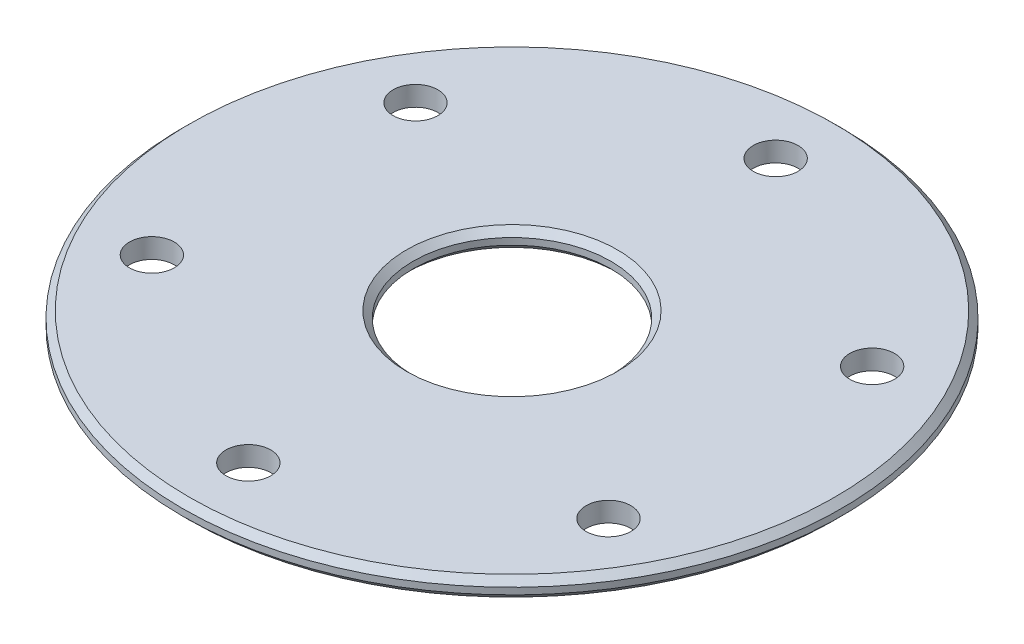
ISO-10303-21;
HEADER;
FILE_DESCRIPTION(('STEP AP214'),'2;1');
FILE_NAME('part.step','',(''),(''),'','','');
FILE_SCHEMA(('AUTOMOTIVE_DESIGN { 1 0 10303 214 1 1 1 1 }'));
ENDSEC;
DATA;
#1=APPLICATION_CONTEXT('core data for automotive mechanical design processes');
#2=APPLICATION_PROTOCOL_DEFINITION('international standard','automotive_design',2000,#1);
#3=PRODUCT_CONTEXT('',#1,'mechanical');
#4=PRODUCT('Part','Part','',(#3));
#5=PRODUCT_RELATED_PRODUCT_CATEGORY('part','',(#4));
#6=PRODUCT_DEFINITION_FORMATION('','',#4);
#7=PRODUCT_DEFINITION_CONTEXT('part definition',#1,'design');
#8=PRODUCT_DEFINITION('design','',#6,#7);
#9=PRODUCT_DEFINITION_SHAPE('','',#8);
#10=(LENGTH_UNIT() NAMED_UNIT(*) SI_UNIT(.MILLI.,.METRE.));
#11=(NAMED_UNIT(*) PLANE_ANGLE_UNIT() SI_UNIT($,.RADIAN.));
#12=(NAMED_UNIT(*) SI_UNIT($,.STERADIAN.) SOLID_ANGLE_UNIT());
#13=UNCERTAINTY_MEASURE_WITH_UNIT(LENGTH_MEASURE(1.E-05),#10,'distance_accuracy_value','');
#14=(GEOMETRIC_REPRESENTATION_CONTEXT(3) GLOBAL_UNCERTAINTY_ASSIGNED_CONTEXT((#13)) GLOBAL_UNIT_ASSIGNED_CONTEXT((#10,
#11,#12)) REPRESENTATION_CONTEXT('',''));
#15=CARTESIAN_POINT('',(0.,0.,0.));
#16=DIRECTION('',(0.,0.,1.));
#17=DIRECTION('',(1.,0.,0.));
#18=AXIS2_PLACEMENT_3D('',#15,#16,#17);
#19=CARTESIAN_POINT('',(0.,3.,0.));
#20=DIRECTION('',(0.,-1.,0.));
#21=DIRECTION('',(0.,0.,-1.));
#22=AXIS2_PLACEMENT_3D('',#19,#20,#21);
#23=CYLINDRICAL_SURFACE('',#22,50.);
#24=CARTESIAN_POINT('',(0.,1.99999999999999,0.));
#25=DIRECTION('',(0.,1.,0.));
#26=DIRECTION('',(0.,0.,1.));
#27=AXIS2_PLACEMENT_3D('',#24,#25,#26);
#28=CIRCLE('',#27,50.);
#29=CARTESIAN_POINT('',(0.,1.99999999999999,50.));
#30=VERTEX_POINT('',#29);
#31=EDGE_CURVE('E10',#30,#30,#28,.F.);
#32=ORIENTED_EDGE('',*,*,#31,.T.);
#33=EDGE_LOOP('',(#32));
#34=FACE_BOUND('',#33,.T.);
#35=CARTESIAN_POINT('',(0.,1.,0.));
#36=DIRECTION('',(0.,1.,0.));
#37=DIRECTION('',(0.,0.,1.));
#38=AXIS2_PLACEMENT_3D('',#35,#36,#37);
#39=CIRCLE('',#38,50.);
#40=CARTESIAN_POINT('',(0.,1.,50.));
#41=VERTEX_POINT('',#40);
#42=EDGE_CURVE('E44',#41,#41,#39,.T.);
#43=ORIENTED_EDGE('',*,*,#42,.T.);
#44=EDGE_LOOP('',(#43));
#45=FACE_BOUND('',#44,.T.);
#46=ADVANCED_FACE('F36',(#34,#45),#23,.T.);
#47=CARTESIAN_POINT('',(0.,3.,0.));
#48=DIRECTION('',(0.,1.,0.));
#49=DIRECTION('',(0.,0.,1.));
#50=AXIS2_PLACEMENT_3D('',#47,#48,#49);
#51=PLANE('',#50);
#52=CARTESIAN_POINT('',(0.,3.,0.));
#53=DIRECTION('',(0.,1.,0.));
#54=DIRECTION('',(0.,0.,1.));
#55=AXIS2_PLACEMENT_3D('',#52,#53,#54);
#56=CIRCLE('',#55,16.);
#57=CARTESIAN_POINT('',(0.,3.,16.));
#58=VERTEX_POINT('',#57);
#59=EDGE_CURVE('E63',#58,#58,#56,.F.);
#60=ORIENTED_EDGE('',*,*,#59,.T.);
#61=EDGE_LOOP('',(#60));
#62=FACE_BOUND('',#61,.T.);
#63=CARTESIAN_POINT('',(0.,3.,0.));
#64=DIRECTION('',(0.,1.,0.));
#65=DIRECTION('',(0.,0.,1.));
#66=AXIS2_PLACEMENT_3D('',#63,#64,#65);
#67=CIRCLE('',#66,49.);
#68=CARTESIAN_POINT('',(0.,3.,49.));
#69=VERTEX_POINT('',#68);
#70=EDGE_CURVE('E66',#69,#69,#67,.T.);
#71=ORIENTED_EDGE('',*,*,#70,.T.);
#72=EDGE_LOOP('',(#71));
#73=FACE_BOUND('',#72,.T.);
#74=CARTESIAN_POINT('',(-34.6410161513773,3.,20.0000000000004));
#75=DIRECTION('',(0.,1.,0.));
#76=DIRECTION('',(-0.866025403784433,0.,0.50000000000001));
#77=AXIS2_PLACEMENT_3D('',#74,#75,#76);
#78=CIRCLE('',#77,3.39999999999999);
#79=CARTESIAN_POINT('',(-37.5855025242444,3.,21.7000000000004));
#80=VERTEX_POINT('',#79);
#81=EDGE_CURVE('E86',#80,#80,#78,.T.);
#82=ORIENTED_EDGE('',*,*,#81,.F.);
#83=EDGE_LOOP('',(#82));
#84=FACE_BOUND('',#83,.T.);
#85=CARTESIAN_POINT('',(-34.6410161513777,3.,-19.9999999999997));
#86=DIRECTION('',(0.,1.,0.));
#87=DIRECTION('',(-0.866025403784443,0.,-0.499999999999992));
#88=AXIS2_PLACEMENT_3D('',#85,#86,#87);
#89=CIRCLE('',#88,3.39999999999999);
#90=CARTESIAN_POINT('',(-37.5855025242448,3.,-21.6999999999996));
#91=VERTEX_POINT('',#90);
#92=EDGE_CURVE('E85',#91,#91,#89,.T.);
#93=ORIENTED_EDGE('',*,*,#92,.F.);
#94=EDGE_LOOP('',(#93));
#95=FACE_BOUND('',#94,.T.);
#96=CARTESIAN_POINT('',(0.,3.,-40.));
#97=DIRECTION('',(0.,1.,0.));
#98=DIRECTION('',(0.,0.,-1.));
#99=AXIS2_PLACEMENT_3D('',#96,#97,#98);
#100=CIRCLE('',#99,3.39999999999999);
#101=CARTESIAN_POINT('',(0.,3.,-43.4));
#102=VERTEX_POINT('',#101);
#103=EDGE_CURVE('E92',#102,#102,#100,.T.);
#104=ORIENTED_EDGE('',*,*,#103,.F.);
#105=EDGE_LOOP('',(#104));
#106=FACE_BOUND('',#105,.T.);
#107=CARTESIAN_POINT('',(34.6410161513775,3.,-20.0000000000002));
#108=DIRECTION('',(0.,1.,0.));
#109=DIRECTION('',(0.866025403784436,0.,-0.500000000000004));
#110=AXIS2_PLACEMENT_3D('',#107,#108,#109);
#111=CIRCLE('',#110,3.39999999999999);
#112=CARTESIAN_POINT('',(37.5855025242445,3.,-21.7000000000002));
#113=VERTEX_POINT('',#112);
#114=EDGE_CURVE('E98',#113,#113,#111,.T.);
#115=ORIENTED_EDGE('',*,*,#114,.F.);
#116=EDGE_LOOP('',(#115));
#117=FACE_BOUND('',#116,.T.);
#118=CARTESIAN_POINT('',(34.6410161513776,3.,19.9999999999999));
#119=DIRECTION('',(0.,1.,0.));
#120=DIRECTION('',(0.86602540378444,0.,0.499999999999998));
#121=AXIS2_PLACEMENT_3D('',#118,#119,#120);
#122=CIRCLE('',#121,3.39999999999999);
#123=CARTESIAN_POINT('',(37.5855025242447,3.,21.6999999999999));
#124=VERTEX_POINT('',#123);
#125=EDGE_CURVE('E78',#124,#124,#122,.T.);
#126=ORIENTED_EDGE('',*,*,#125,.F.);
#127=EDGE_LOOP('',(#126));
#128=FACE_BOUND('',#127,.T.);
#129=CARTESIAN_POINT('',(0.,3.,40.));
#130=DIRECTION('',(0.,1.,0.));
#131=DIRECTION('',(0.,0.,1.));
#132=AXIS2_PLACEMENT_3D('',#129,#130,#131);
#133=CIRCLE('',#132,3.39999999999999);
#134=CARTESIAN_POINT('',(0.,3.,43.4));
#135=VERTEX_POINT('',#134);
#136=EDGE_CURVE('E69',#135,#135,#133,.T.);
#137=ORIENTED_EDGE('',*,*,#136,.F.);
#138=EDGE_LOOP('',(#137));
#139=FACE_BOUND('',#138,.T.);
#140=ADVANCED_FACE('F109',(#62,#73,#84,#95,#106,#117,#128,#139),#51,.T.);
#141=CARTESIAN_POINT('',(0.,0.,0.));
#142=DIRECTION('',(0.,1.,0.));
#143=DIRECTION('',(0.,0.,1.));
#144=AXIS2_PLACEMENT_3D('',#141,#142,#143);
#145=PLANE('',#144);
#146=CARTESIAN_POINT('',(0.,0.,0.));
#147=DIRECTION('',(0.,1.,0.));
#148=DIRECTION('',(0.,0.,1.));
#149=AXIS2_PLACEMENT_3D('',#146,#147,#148);
#150=CIRCLE('',#149,16.);
#151=CARTESIAN_POINT('',(0.,0.,16.));
#152=VERTEX_POINT('',#151);
#153=EDGE_CURVE('E48',#152,#152,#150,.T.);
#154=ORIENTED_EDGE('',*,*,#153,.T.);
#155=EDGE_LOOP('',(#154));
#156=FACE_BOUND('',#155,.T.);
#157=CARTESIAN_POINT('',(0.,0.,0.));
#158=DIRECTION('',(0.,1.,0.));
#159=DIRECTION('',(0.,0.,1.));
#160=AXIS2_PLACEMENT_3D('',#157,#158,#159);
#161=CIRCLE('',#160,49.);
#162=CARTESIAN_POINT('',(0.,0.,49.));
#163=VERTEX_POINT('',#162);
#164=EDGE_CURVE('E52',#163,#163,#161,.F.);
#165=ORIENTED_EDGE('',*,*,#164,.T.);
#166=EDGE_LOOP('',(#165));
#167=FACE_BOUND('',#166,.T.);
#168=CARTESIAN_POINT('',(-34.6410161513773,0.,20.0000000000004));
#169=DIRECTION('',(0.,-1.,0.));
#170=DIRECTION('',(0.866025403784433,0.,-0.50000000000001));
#171=AXIS2_PLACEMENT_3D('',#168,#169,#170);
#172=CIRCLE('',#171,3.39999999999999);
#173=CARTESIAN_POINT('',(-31.6965297785103,0.,18.3000000000004));
#174=VERTEX_POINT('',#173);
#175=EDGE_CURVE('E82',#174,#174,#172,.T.);
#176=ORIENTED_EDGE('',*,*,#175,.F.);
#177=EDGE_LOOP('',(#176));
#178=FACE_BOUND('',#177,.T.);
#179=CARTESIAN_POINT('',(-34.6410161513777,0.,-19.9999999999997));
#180=DIRECTION('',(0.,-1.,0.));
#181=DIRECTION('',(0.866025403784443,0.,0.499999999999992));
#182=AXIS2_PLACEMENT_3D('',#179,#180,#181);
#183=CIRCLE('',#182,3.39999999999999);
#184=CARTESIAN_POINT('',(-31.6965297785106,0.,-18.2999999999997));
#185=VERTEX_POINT('',#184);
#186=EDGE_CURVE('E89',#185,#185,#183,.T.);
#187=ORIENTED_EDGE('',*,*,#186,.F.);
#188=EDGE_LOOP('',(#187));
#189=FACE_BOUND('',#188,.T.);
#190=CARTESIAN_POINT('',(0.,0.,-40.));
#191=DIRECTION('',(0.,-1.,0.));
#192=DIRECTION('',(0.,0.,1.));
#193=AXIS2_PLACEMENT_3D('',#190,#191,#192);
#194=CIRCLE('',#193,3.39999999999999);
#195=CARTESIAN_POINT('',(0.,0.,-36.6));
#196=VERTEX_POINT('',#195);
#197=EDGE_CURVE('E95',#196,#196,#194,.T.);
#198=ORIENTED_EDGE('',*,*,#197,.F.);
#199=EDGE_LOOP('',(#198));
#200=FACE_BOUND('',#199,.T.);
#201=CARTESIAN_POINT('',(34.6410161513775,0.,-20.0000000000002));
#202=DIRECTION('',(0.,-1.,0.));
#203=DIRECTION('',(-0.866025403784436,0.,0.500000000000004));
#204=AXIS2_PLACEMENT_3D('',#201,#202,#203);
#205=CIRCLE('',#204,3.39999999999999);
#206=CARTESIAN_POINT('',(31.6965297785104,0.,-18.3000000000002));
#207=VERTEX_POINT('',#206);
#208=EDGE_CURVE('E81',#207,#207,#205,.T.);
#209=ORIENTED_EDGE('',*,*,#208,.F.);
#210=EDGE_LOOP('',(#209));
#211=FACE_BOUND('',#210,.T.);
#212=CARTESIAN_POINT('',(34.6410161513776,0.,19.9999999999999));
#213=DIRECTION('',(0.,-1.,0.));
#214=DIRECTION('',(-0.86602540378444,0.,-0.499999999999998));
#215=AXIS2_PLACEMENT_3D('',#212,#213,#214);
#216=CIRCLE('',#215,3.39999999999999);
#217=CARTESIAN_POINT('',(31.6965297785105,0.,18.2999999999999));
#218=VERTEX_POINT('',#217);
#219=EDGE_CURVE('E75',#218,#218,#216,.T.);
#220=ORIENTED_EDGE('',*,*,#219,.F.);
#221=EDGE_LOOP('',(#220));
#222=FACE_BOUND('',#221,.T.);
#223=CARTESIAN_POINT('',(0.,0.,40.));
#224=DIRECTION('',(0.,-1.,0.));
#225=DIRECTION('',(0.,0.,-1.));
#226=AXIS2_PLACEMENT_3D('',#223,#224,#225);
#227=CIRCLE('',#226,3.39999999999999);
#228=CARTESIAN_POINT('',(0.,0.,36.6));
#229=VERTEX_POINT('',#228);
#230=EDGE_CURVE('E72',#229,#229,#227,.T.);
#231=ORIENTED_EDGE('',*,*,#230,.F.);
#232=EDGE_LOOP('',(#231));
#233=FACE_BOUND('',#232,.T.);
#234=ADVANCED_FACE('F112',(#156,#167,#178,#189,#200,#211,#222,#233),#145,.F.);
#235=CARTESIAN_POINT('',(0.,0.,40.));
#236=DIRECTION('',(0.,-1.,0.));
#237=DIRECTION('',(0.,0.,-1.));
#238=AXIS2_PLACEMENT_3D('',#235,#236,#237);
#239=CYLINDRICAL_SURFACE('',#238,3.39999999999999);
#240=ORIENTED_EDGE('',*,*,#136,.T.);
#241=EDGE_LOOP('',(#240));
#242=FACE_BOUND('',#241,.T.);
#243=ORIENTED_EDGE('',*,*,#230,.T.);
#244=EDGE_LOOP('',(#243));
#245=FACE_BOUND('',#244,.T.);
#246=ADVANCED_FACE('F119',(#242,#245),#239,.F.);
#247=CARTESIAN_POINT('',(34.6410161513776,0.,19.9999999999999));
#248=DIRECTION('',(0.,-1.,0.));
#249=DIRECTION('',(-0.86602540378444,0.,-0.499999999999998));
#250=AXIS2_PLACEMENT_3D('',#247,#248,#249);
#251=CYLINDRICAL_SURFACE('',#250,3.39999999999999);
#252=ORIENTED_EDGE('',*,*,#125,.T.);
#253=EDGE_LOOP('',(#252));
#254=FACE_BOUND('',#253,.T.);
#255=ORIENTED_EDGE('',*,*,#219,.T.);
#256=EDGE_LOOP('',(#255));
#257=FACE_BOUND('',#256,.T.);
#258=ADVANCED_FACE('F122',(#254,#257),#251,.F.);
#259=CARTESIAN_POINT('',(34.6410161513775,0.,-20.0000000000002));
#260=DIRECTION('',(0.,-1.,0.));
#261=DIRECTION('',(-0.866025403784436,0.,0.500000000000004));
#262=AXIS2_PLACEMENT_3D('',#259,#260,#261);
#263=CYLINDRICAL_SURFACE('',#262,3.39999999999999);
#264=ORIENTED_EDGE('',*,*,#114,.T.);
#265=EDGE_LOOP('',(#264));
#266=FACE_BOUND('',#265,.T.);
#267=ORIENTED_EDGE('',*,*,#208,.T.);
#268=EDGE_LOOP('',(#267));
#269=FACE_BOUND('',#268,.T.);
#270=ADVANCED_FACE('F106',(#266,#269),#263,.F.);
#271=CARTESIAN_POINT('',(0.,0.,-40.));
#272=DIRECTION('',(0.,-1.,0.));
#273=DIRECTION('',(0.,0.,1.));
#274=AXIS2_PLACEMENT_3D('',#271,#272,#273);
#275=CYLINDRICAL_SURFACE('',#274,3.39999999999999);
#276=ORIENTED_EDGE('',*,*,#103,.T.);
#277=EDGE_LOOP('',(#276));
#278=FACE_BOUND('',#277,.T.);
#279=ORIENTED_EDGE('',*,*,#197,.T.);
#280=EDGE_LOOP('',(#279));
#281=FACE_BOUND('',#280,.T.);
#282=ADVANCED_FACE('F171',(#278,#281),#275,.F.);
#283=CARTESIAN_POINT('',(-34.6410161513777,0.,-19.9999999999997));
#284=DIRECTION('',(0.,-1.,0.));
#285=DIRECTION('',(0.866025403784443,0.,0.499999999999992));
#286=AXIS2_PLACEMENT_3D('',#283,#284,#285);
#287=CYLINDRICAL_SURFACE('',#286,3.39999999999999);
#288=ORIENTED_EDGE('',*,*,#92,.T.);
#289=EDGE_LOOP('',(#288));
#290=FACE_BOUND('',#289,.T.);
#291=ORIENTED_EDGE('',*,*,#186,.T.);
#292=EDGE_LOOP('',(#291));
#293=FACE_BOUND('',#292,.T.);
#294=ADVANCED_FACE('F174',(#290,#293),#287,.F.);
#295=CARTESIAN_POINT('',(-34.6410161513773,0.,20.0000000000004));
#296=DIRECTION('',(0.,-1.,0.));
#297=DIRECTION('',(0.866025403784433,0.,-0.50000000000001));
#298=AXIS2_PLACEMENT_3D('',#295,#296,#297);
#299=CYLINDRICAL_SURFACE('',#298,3.39999999999999);
#300=ORIENTED_EDGE('',*,*,#81,.T.);
#301=EDGE_LOOP('',(#300));
#302=FACE_BOUND('',#301,.T.);
#303=ORIENTED_EDGE('',*,*,#175,.T.);
#304=EDGE_LOOP('',(#303));
#305=FACE_BOUND('',#304,.T.);
#306=ADVANCED_FACE('F191',(#302,#305),#299,.F.);
#307=CARTESIAN_POINT('',(0.,3.,0.));
#308=DIRECTION('',(0.,-1.,0.));
#309=DIRECTION('',(0.,0.,-1.));
#310=AXIS2_PLACEMENT_3D('',#307,#308,#309);
#311=CYLINDRICAL_SURFACE('',#310,15.);
#312=CARTESIAN_POINT('',(0.,1.99999999999998,0.));
#313=DIRECTION('',(0.,1.,0.));
#314=DIRECTION('',(0.,0.,1.));
#315=AXIS2_PLACEMENT_3D('',#312,#313,#314);
#316=CIRCLE('',#315,15.);
#317=CARTESIAN_POINT('',(0.,1.99999999999998,15.));
#318=VERTEX_POINT('',#317);
#319=EDGE_CURVE('E57',#318,#318,#316,.T.);
#320=ORIENTED_EDGE('',*,*,#319,.T.);
#321=EDGE_LOOP('',(#320));
#322=FACE_BOUND('',#321,.T.);
#323=CARTESIAN_POINT('',(0.,0.999999999999985,0.));
#324=DIRECTION('',(0.,1.,0.));
#325=DIRECTION('',(0.,0.,1.));
#326=AXIS2_PLACEMENT_3D('',#323,#324,#325);
#327=CIRCLE('',#326,15.);
#328=CARTESIAN_POINT('',(0.,0.999999999999985,15.));
#329=VERTEX_POINT('',#328);
#330=EDGE_CURVE('E60',#329,#329,#327,.F.);
#331=ORIENTED_EDGE('',*,*,#330,.T.);
#332=EDGE_LOOP('',(#331));
#333=FACE_BOUND('',#332,.T.);
#334=ADVANCED_FACE('F145',(#322,#333),#311,.F.);
#335=CARTESIAN_POINT('',(0.,3.,0.));
#336=DIRECTION('',(0.,1.,0.));
#337=DIRECTION('',(0.,0.,1.));
#338=AXIS2_PLACEMENT_3D('',#335,#336,#337);
#339=CONICAL_SURFACE('',#338,16.,0.78539816339744);
#340=ORIENTED_EDGE('',*,*,#319,.F.);
#341=EDGE_LOOP('',(#340));
#342=FACE_BOUND('',#341,.T.);
#343=ORIENTED_EDGE('',*,*,#59,.F.);
#344=EDGE_LOOP('',(#343));
#345=FACE_BOUND('',#344,.T.);
#346=ADVANCED_FACE('F138',(#342,#345),#339,.F.);
#347=CARTESIAN_POINT('',(0.,0.999999999999985,0.));
#348=DIRECTION('',(0.,-1.,0.));
#349=DIRECTION('',(0.,0.,-1.));
#350=AXIS2_PLACEMENT_3D('',#347,#348,#349);
#351=CONICAL_SURFACE('',#350,15.,0.785398163397449);
#352=ORIENTED_EDGE('',*,*,#153,.F.);
#353=EDGE_LOOP('',(#352));
#354=FACE_BOUND('',#353,.T.);
#355=ORIENTED_EDGE('',*,*,#330,.F.);
#356=EDGE_LOOP('',(#355));
#357=FACE_BOUND('',#356,.T.);
#358=ADVANCED_FACE('F144',(#354,#357),#351,.F.);
#359=CARTESIAN_POINT('',(0.,3.,0.));
#360=DIRECTION('',(0.,-1.,0.));
#361=DIRECTION('',(0.,0.,-1.));
#362=AXIS2_PLACEMENT_3D('',#359,#360,#361);
#363=CONICAL_SURFACE('',#362,49.,0.785398163397438);
#364=ORIENTED_EDGE('',*,*,#31,.F.);
#365=EDGE_LOOP('',(#364));
#366=FACE_BOUND('',#365,.T.);
#367=ORIENTED_EDGE('',*,*,#70,.F.);
#368=EDGE_LOOP('',(#367));
#369=FACE_BOUND('',#368,.T.);
#370=ADVANCED_FACE('F151',(#366,#369),#363,.T.);
#371=CARTESIAN_POINT('',(0.,1.,0.));
#372=DIRECTION('',(0.,1.,0.));
#373=DIRECTION('',(0.,0.,1.));
#374=AXIS2_PLACEMENT_3D('',#371,#372,#373);
#375=CONICAL_SURFACE('',#374,50.,0.785398163397452);
#376=ORIENTED_EDGE('',*,*,#164,.F.);
#377=EDGE_LOOP('',(#376));
#378=FACE_BOUND('',#377,.T.);
#379=ORIENTED_EDGE('',*,*,#42,.F.);
#380=EDGE_LOOP('',(#379));
#381=FACE_BOUND('',#380,.T.);
#382=ADVANCED_FACE('F39',(#378,#381),#375,.T.);
#383=CLOSED_SHELL('',(#46,#140,#234,#246,#258,#270,#282,#294,#306,#334,#346,#358,#370,#382));
#384=MANIFOLD_SOLID_BREP('B2',#383);
#385=ADVANCED_BREP_SHAPE_REPRESENTATION('',(#18,#384),#14);
#386=SHAPE_DEFINITION_REPRESENTATION(#9,#385);
ENDSEC;
END-ISO-10303-21;
